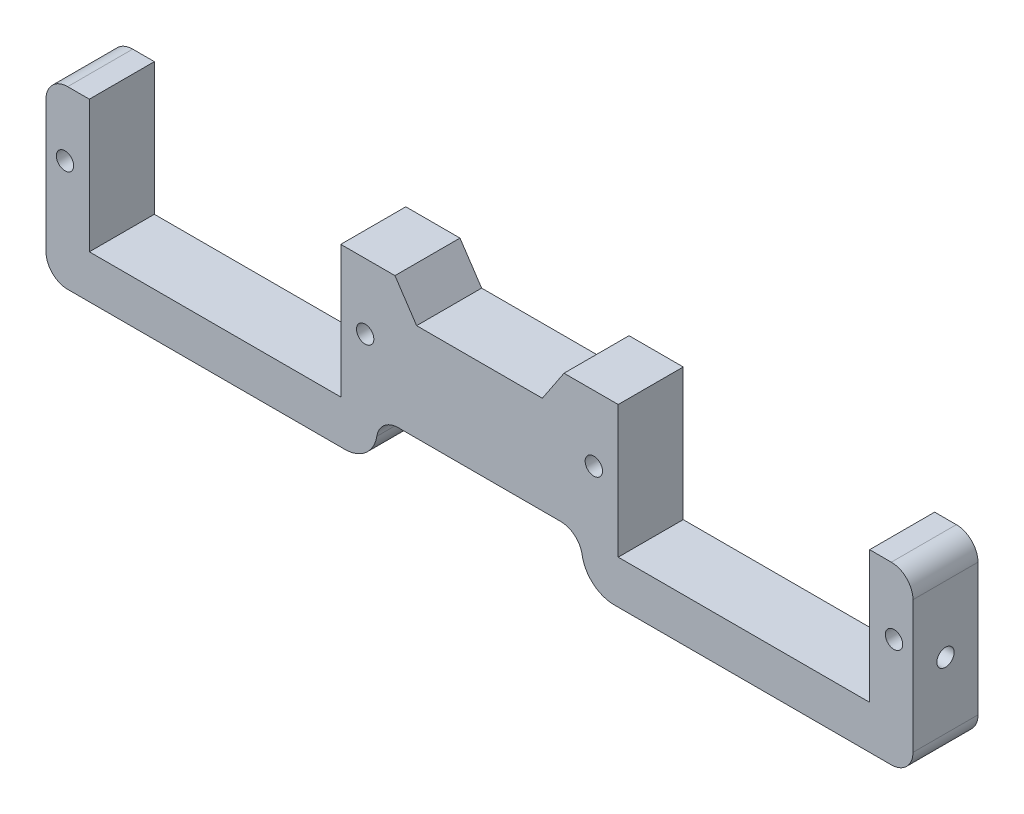
ISO-10303-21;
HEADER;
FILE_DESCRIPTION(('STEP AP214'),'2;1');
FILE_NAME('part.step','',(''),(''),'','','');
FILE_SCHEMA(('AUTOMOTIVE_DESIGN { 1 0 10303 214 1 1 1 1 }'));
ENDSEC;
DATA;
#1=APPLICATION_CONTEXT('core data for automotive mechanical design processes');
#2=APPLICATION_PROTOCOL_DEFINITION('international standard','automotive_design',2000,#1);
#3=PRODUCT_CONTEXT('',#1,'mechanical');
#4=PRODUCT('Part','Part','',(#3));
#5=PRODUCT_RELATED_PRODUCT_CATEGORY('part','',(#4));
#6=PRODUCT_DEFINITION_FORMATION('','',#4);
#7=PRODUCT_DEFINITION_CONTEXT('part definition',#1,'design');
#8=PRODUCT_DEFINITION('design','',#6,#7);
#9=PRODUCT_DEFINITION_SHAPE('','',#8);
#10=(LENGTH_UNIT() NAMED_UNIT(*) SI_UNIT(.MILLI.,.METRE.));
#11=(NAMED_UNIT(*) PLANE_ANGLE_UNIT() SI_UNIT($,.RADIAN.));
#12=(NAMED_UNIT(*) SI_UNIT($,.STERADIAN.) SOLID_ANGLE_UNIT());
#13=UNCERTAINTY_MEASURE_WITH_UNIT(LENGTH_MEASURE(1.E-05),#10,'distance_accuracy_value','');
#14=(GEOMETRIC_REPRESENTATION_CONTEXT(3) GLOBAL_UNCERTAINTY_ASSIGNED_CONTEXT((#13)) GLOBAL_UNIT_ASSIGNED_CONTEXT((#10,
#11,#12)) REPRESENTATION_CONTEXT('',''));
#15=CARTESIAN_POINT('',(0.,0.,0.));
#16=DIRECTION('',(0.,0.,1.));
#17=DIRECTION('',(1.,0.,0.));
#18=AXIS2_PLACEMENT_3D('',#15,#16,#17);
#19=CARTESIAN_POINT('',(38.,14.2,3.));
#20=DIRECTION('',(0.,0.,-1.));
#21=DIRECTION('',(-1.,0.,0.));
#22=AXIS2_PLACEMENT_3D('',#19,#20,#21);
#23=PLANE('',#22);
#24=CARTESIAN_POINT('',(7.49999999999999,2.19994295650091,3.));
#25=DIRECTION('',(0.,0.,-1.));
#26=DIRECTION('',(1.,0.,0.));
#27=AXIS2_PLACEMENT_3D('',#24,#25,#26);
#28=CIRCLE('',#27,2.);
#29=CARTESIAN_POINT('',(7.49999999999999,4.19994295650091,3.));
#30=VERTEX_POINT('',#29);
#31=CARTESIAN_POINT('',(9.47423033011439,2.51996577390055,3.));
#32=VERTEX_POINT('',#31);
#33=EDGE_CURVE('E489',#30,#32,#28,.T.);
#34=ORIENTED_EDGE('',*,*,#33,.T.);
#35=CARTESIAN_POINT('',(12.435575825286,3.,3.));
#36=DIRECTION('',(0.,0.,-1.));
#37=DIRECTION('',(-1.,0.,0.));
#38=AXIS2_PLACEMENT_3D('',#35,#36,#37);
#39=CIRCLE('',#38,3.);
#40=CARTESIAN_POINT('',(12.435575825286,0.,3.));
#41=VERTEX_POINT('',#40);
#42=EDGE_CURVE('E266',#32,#41,#39,.F.);
#43=ORIENTED_EDGE('',*,*,#42,.T.);
#44=DIRECTION('',(1.,0.,0.));
#45=VECTOR('',#44,1.);
#46=CARTESIAN_POINT('',(9.50000000000001,0.,3.));
#47=LINE('',#46,#45);
#48=CARTESIAN_POINT('',(38.,0.,3.));
#49=VERTEX_POINT('',#48);
#50=EDGE_CURVE('E486',#41,#49,#47,.T.);
#51=ORIENTED_EDGE('',*,*,#50,.T.);
#52=CARTESIAN_POINT('',(38.,2.,3.));
#53=DIRECTION('',(0.,0.,1.));
#54=DIRECTION('',(1.,0.,0.));
#55=AXIS2_PLACEMENT_3D('',#52,#53,#54);
#56=CIRCLE('',#55,2.);
#57=CARTESIAN_POINT('',(40.,2.,3.));
#58=VERTEX_POINT('',#57);
#59=EDGE_CURVE('E483',#49,#58,#56,.T.);
#60=ORIENTED_EDGE('',*,*,#59,.T.);
#61=DIRECTION('',(0.,1.,0.));
#62=VECTOR('',#61,1.);
#63=CARTESIAN_POINT('',(40.,2.00000000000001,3.));
#64=LINE('',#63,#62);
#65=CARTESIAN_POINT('',(40.,14.2,3.));
#66=VERTEX_POINT('',#65);
#67=EDGE_CURVE('E480',#58,#66,#64,.T.);
#68=ORIENTED_EDGE('',*,*,#67,.T.);
#69=CARTESIAN_POINT('',(38.,14.2,3.));
#70=DIRECTION('',(0.,0.,1.));
#71=DIRECTION('',(-1.,0.,0.));
#72=AXIS2_PLACEMENT_3D('',#69,#70,#71);
#73=CIRCLE('',#72,2.);
#74=CARTESIAN_POINT('',(38.,16.2,3.));
#75=VERTEX_POINT('',#74);
#76=EDGE_CURVE('E477',#66,#75,#73,.T.);
#77=ORIENTED_EDGE('',*,*,#76,.T.);
#78=DIRECTION('',(-1.,0.,0.));
#79=VECTOR('',#78,1.);
#80=CARTESIAN_POINT('',(38.,16.2,3.));
#81=LINE('',#80,#79);
#82=CARTESIAN_POINT('',(36.,16.2,3.));
#83=VERTEX_POINT('',#82);
#84=EDGE_CURVE('E474',#75,#83,#81,.T.);
#85=ORIENTED_EDGE('',*,*,#84,.T.);
#86=DIRECTION('',(0.,-1.,0.));
#87=VECTOR('',#86,1.);
#88=CARTESIAN_POINT('',(36.,16.2,3.));
#89=LINE('',#88,#87);
#90=CARTESIAN_POINT('',(36.,4.00000000000001,3.));
#91=VERTEX_POINT('',#90);
#92=EDGE_CURVE('E471',#83,#91,#89,.T.);
#93=ORIENTED_EDGE('',*,*,#92,.T.);
#94=DIRECTION('',(-1.,0.,0.));
#95=VECTOR('',#94,1.);
#96=CARTESIAN_POINT('',(36.,4.00000000000001,3.));
#97=LINE('',#96,#95);
#98=CARTESIAN_POINT('',(12.8,4.,3.));
#99=VERTEX_POINT('',#98);
#100=EDGE_CURVE('E468',#91,#99,#97,.T.);
#101=ORIENTED_EDGE('',*,*,#100,.T.);
#102=DIRECTION('',(0.,1.,0.));
#103=VECTOR('',#102,1.);
#104=CARTESIAN_POINT('',(12.8,4.,3.));
#105=LINE('',#104,#103);
#106=CARTESIAN_POINT('',(12.8,16.2,3.));
#107=VERTEX_POINT('',#106);
#108=EDGE_CURVE('E465',#99,#107,#105,.T.);
#109=ORIENTED_EDGE('',*,*,#108,.T.);
#110=DIRECTION('',(-1.,0.,0.));
#111=VECTOR('',#110,1.);
#112=CARTESIAN_POINT('',(12.8,16.2,3.));
#113=LINE('',#112,#111);
#114=CARTESIAN_POINT('',(7.8,16.2,3.));
#115=VERTEX_POINT('',#114);
#116=EDGE_CURVE('E462',#107,#115,#113,.T.);
#117=ORIENTED_EDGE('',*,*,#116,.T.);
#118=DIRECTION('',(-0.554692894290729,-0.832055162247897,0.));
#119=VECTOR('',#118,1.);
#120=CARTESIAN_POINT('',(7.8,16.2,3.));
#121=LINE('',#120,#119);
#122=CARTESIAN_POINT('',(5.8,13.1999429565009,3.));
#123=VERTEX_POINT('',#122);
#124=EDGE_CURVE('E459',#115,#123,#121,.T.);
#125=ORIENTED_EDGE('',*,*,#124,.T.);
#126=DIRECTION('',(-1.,0.,0.));
#127=VECTOR('',#126,1.);
#128=CARTESIAN_POINT('',(-5.8,13.1999429565009,3.));
#129=LINE('',#128,#127);
#130=CARTESIAN_POINT('',(-5.8,13.1999429565009,3.));
#131=VERTEX_POINT('',#130);
#132=EDGE_CURVE('E456',#123,#131,#129,.T.);
#133=ORIENTED_EDGE('',*,*,#132,.T.);
#134=DIRECTION('',(-0.554692894290729,0.832055162247897,0.));
#135=VECTOR('',#134,1.);
#136=CARTESIAN_POINT('',(-7.8,16.2,3.));
#137=LINE('',#136,#135);
#138=CARTESIAN_POINT('',(-7.8,16.2,3.));
#139=VERTEX_POINT('',#138);
#140=EDGE_CURVE('E453',#131,#139,#137,.T.);
#141=ORIENTED_EDGE('',*,*,#140,.T.);
#142=DIRECTION('',(-1.,0.,0.));
#143=VECTOR('',#142,1.);
#144=CARTESIAN_POINT('',(-12.8,16.2,3.));
#145=LINE('',#144,#143);
#146=CARTESIAN_POINT('',(-12.8,16.2,3.));
#147=VERTEX_POINT('',#146);
#148=EDGE_CURVE('E450',#139,#147,#145,.T.);
#149=ORIENTED_EDGE('',*,*,#148,.T.);
#150=DIRECTION('',(0.,-1.,0.));
#151=VECTOR('',#150,1.);
#152=CARTESIAN_POINT('',(-12.8,4.,3.));
#153=LINE('',#152,#151);
#154=CARTESIAN_POINT('',(-12.8,4.,3.));
#155=VERTEX_POINT('',#154);
#156=EDGE_CURVE('E447',#147,#155,#153,.T.);
#157=ORIENTED_EDGE('',*,*,#156,.T.);
#158=DIRECTION('',(-1.,0.,0.));
#159=VECTOR('',#158,1.);
#160=CARTESIAN_POINT('',(-36.,4.,3.));
#161=LINE('',#160,#159);
#162=CARTESIAN_POINT('',(-36.,4.,3.));
#163=VERTEX_POINT('',#162);
#164=EDGE_CURVE('E234',#155,#163,#161,.T.);
#165=ORIENTED_EDGE('',*,*,#164,.T.);
#166=DIRECTION('',(0.,1.,0.));
#167=VECTOR('',#166,1.);
#168=CARTESIAN_POINT('',(-36.,16.2,3.));
#169=LINE('',#168,#167);
#170=CARTESIAN_POINT('',(-36.,16.2,3.));
#171=VERTEX_POINT('',#170);
#172=EDGE_CURVE('E228',#163,#171,#169,.T.);
#173=ORIENTED_EDGE('',*,*,#172,.T.);
#174=DIRECTION('',(-1.,0.,0.));
#175=VECTOR('',#174,1.);
#176=CARTESIAN_POINT('',(-38.,16.2,3.));
#177=LINE('',#176,#175);
#178=CARTESIAN_POINT('',(-38.,16.2,3.));
#179=VERTEX_POINT('',#178);
#180=EDGE_CURVE('E217',#171,#179,#177,.T.);
#181=ORIENTED_EDGE('',*,*,#180,.T.);
#182=CARTESIAN_POINT('',(-38.,14.2,3.));
#183=DIRECTION('',(0.,0.,1.));
#184=DIRECTION('',(-1.,0.,0.));
#185=AXIS2_PLACEMENT_3D('',#182,#183,#184);
#186=CIRCLE('',#185,2.);
#187=CARTESIAN_POINT('',(-40.,14.2,3.));
#188=VERTEX_POINT('',#187);
#189=EDGE_CURVE('E227',#179,#188,#186,.T.);
#190=ORIENTED_EDGE('',*,*,#189,.T.);
#191=DIRECTION('',(0.,-1.,0.));
#192=VECTOR('',#191,1.);
#193=CARTESIAN_POINT('',(-40.,2.00000000000001,3.));
#194=LINE('',#193,#192);
#195=CARTESIAN_POINT('',(-40.,2.00000000000001,3.));
#196=VERTEX_POINT('',#195);
#197=EDGE_CURVE('E428',#188,#196,#194,.T.);
#198=ORIENTED_EDGE('',*,*,#197,.T.);
#199=CARTESIAN_POINT('',(-38.,2.,3.));
#200=DIRECTION('',(0.,0.,1.));
#201=DIRECTION('',(1.,0.,0.));
#202=AXIS2_PLACEMENT_3D('',#199,#200,#201);
#203=CIRCLE('',#202,2.);
#204=CARTESIAN_POINT('',(-38.,0.,3.));
#205=VERTEX_POINT('',#204);
#206=EDGE_CURVE('E500',#196,#205,#203,.T.);
#207=ORIENTED_EDGE('',*,*,#206,.T.);
#208=DIRECTION('',(1.,0.,0.));
#209=VECTOR('',#208,1.);
#210=CARTESIAN_POINT('',(-9.5,0.,3.));
#211=LINE('',#210,#209);
#212=CARTESIAN_POINT('',(-12.435575825286,0.,3.));
#213=VERTEX_POINT('',#212);
#214=EDGE_CURVE('E497',#205,#213,#211,.T.);
#215=ORIENTED_EDGE('',*,*,#214,.T.);
#216=CARTESIAN_POINT('',(-12.435575825286,3.,3.));
#217=DIRECTION('',(0.,0.,-1.));
#218=DIRECTION('',(-1.,0.,0.));
#219=AXIS2_PLACEMENT_3D('',#216,#217,#218);
#220=CIRCLE('',#219,3.);
#221=CARTESIAN_POINT('',(-9.47423033011439,2.51996577390055,3.));
#222=VERTEX_POINT('',#221);
#223=EDGE_CURVE('E59',#213,#222,#220,.F.);
#224=ORIENTED_EDGE('',*,*,#223,.T.);
#225=CARTESIAN_POINT('',(-7.49999999999999,2.19994295650091,3.));
#226=DIRECTION('',(0.,0.,-1.));
#227=DIRECTION('',(1.,0.,0.));
#228=AXIS2_PLACEMENT_3D('',#225,#226,#227);
#229=CIRCLE('',#228,2.);
#230=CARTESIAN_POINT('',(-7.49999999999999,4.19994295650091,3.));
#231=VERTEX_POINT('',#230);
#232=EDGE_CURVE('E277',#222,#231,#229,.T.);
#233=ORIENTED_EDGE('',*,*,#232,.T.);
#234=DIRECTION('',(1.,0.,0.));
#235=VECTOR('',#234,1.);
#236=CARTESIAN_POINT('',(7.49999999999999,4.19994295650091,3.));
#237=LINE('',#236,#235);
#238=EDGE_CURVE('E492',#231,#30,#237,.T.);
#239=ORIENTED_EDGE('',*,*,#238,.T.);
#240=EDGE_LOOP('',(#34,#43,#51,#60,#68,#77,#85,#93,#101,#109,#117,#125,#133,#141,#149,#157,#165,
#173,#181,#190,#198,#207,#215,#224,#233,#239));
#241=FACE_BOUND('',#240,.T.);
#242=CARTESIAN_POINT('',(-10.55,10.1499443478185,3.));
#243=DIRECTION('',(0.,0.,1.));
#244=DIRECTION('',(1.,0.,0.));
#245=AXIS2_PLACEMENT_3D('',#242,#243,#244);
#246=CIRCLE('',#245,0.800000000000001);
#247=CARTESIAN_POINT('',(-9.75,10.1499443478185,3.));
#248=VERTEX_POINT('',#247);
#249=EDGE_CURVE('E444',#248,#248,#246,.T.);
#250=ORIENTED_EDGE('',*,*,#249,.F.);
#251=EDGE_LOOP('',(#250));
#252=FACE_BOUND('',#251,.T.);
#253=CARTESIAN_POINT('',(-38.25,10.1499443478185,3.));
#254=DIRECTION('',(0.,0.,1.));
#255=DIRECTION('',(1.,0.,0.));
#256=AXIS2_PLACEMENT_3D('',#253,#254,#255);
#257=CIRCLE('',#256,0.800000000000002);
#258=CARTESIAN_POINT('',(-37.45,10.1499443478185,3.));
#259=VERTEX_POINT('',#258);
#260=EDGE_CURVE('E511',#259,#259,#257,.T.);
#261=ORIENTED_EDGE('',*,*,#260,.F.);
#262=EDGE_LOOP('',(#261));
#263=FACE_BOUND('',#262,.T.);
#264=CARTESIAN_POINT('',(38.25,10.1499443478185,3.));
#265=DIRECTION('',(0.,0.,1.));
#266=DIRECTION('',(-1.,0.,0.));
#267=AXIS2_PLACEMENT_3D('',#264,#265,#266);
#268=CIRCLE('',#267,0.800000000000002);
#269=CARTESIAN_POINT('',(37.45,10.1499443478185,3.));
#270=VERTEX_POINT('',#269);
#271=EDGE_CURVE('E519',#270,#270,#268,.T.);
#272=ORIENTED_EDGE('',*,*,#271,.F.);
#273=EDGE_LOOP('',(#272));
#274=FACE_BOUND('',#273,.T.);
#275=CARTESIAN_POINT('',(10.55,10.1499443478185,3.));
#276=DIRECTION('',(0.,0.,1.));
#277=DIRECTION('',(-1.,0.,0.));
#278=AXIS2_PLACEMENT_3D('',#275,#276,#277);
#279=CIRCLE('',#278,0.800000000000001);
#280=CARTESIAN_POINT('',(9.75,10.1499443478185,3.));
#281=VERTEX_POINT('',#280);
#282=EDGE_CURVE('E527',#281,#281,#279,.T.);
#283=ORIENTED_EDGE('',*,*,#282,.F.);
#284=EDGE_LOOP('',(#283));
#285=FACE_BOUND('',#284,.T.);
#286=ADVANCED_FACE('F43',(#241,#252,#263,#274,#285),#23,.F.);
#287=CARTESIAN_POINT('',(38.,14.2,-3.));
#288=DIRECTION('',(0.,0.,-1.));
#289=DIRECTION('',(-1.,0.,0.));
#290=AXIS2_PLACEMENT_3D('',#287,#288,#289);
#291=PLANE('',#290);
#292=CARTESIAN_POINT('',(38.25,10.1499443478185,-3.));
#293=DIRECTION('',(0.,0.,1.));
#294=DIRECTION('',(-1.,0.,0.));
#295=AXIS2_PLACEMENT_3D('',#292,#293,#294);
#296=CIRCLE('',#295,0.800000000000002);
#297=CARTESIAN_POINT('',(37.45,10.1499443478185,-3.));
#298=VERTEX_POINT('',#297);
#299=EDGE_CURVE('E523',#298,#298,#296,.T.);
#300=ORIENTED_EDGE('',*,*,#299,.T.);
#301=EDGE_LOOP('',(#300));
#302=FACE_BOUND('',#301,.T.);
#303=CARTESIAN_POINT('',(-10.55,10.1499443478185,-3.));
#304=DIRECTION('',(0.,0.,1.));
#305=DIRECTION('',(1.,0.,0.));
#306=AXIS2_PLACEMENT_3D('',#303,#304,#305);
#307=CIRCLE('',#306,0.800000000000001);
#308=CARTESIAN_POINT('',(-9.75,10.1499443478185,-3.));
#309=VERTEX_POINT('',#308);
#310=EDGE_CURVE('E507',#309,#309,#307,.T.);
#311=ORIENTED_EDGE('',*,*,#310,.T.);
#312=EDGE_LOOP('',(#311));
#313=FACE_BOUND('',#312,.T.);
#314=DIRECTION('',(1.,0.,0.));
#315=VECTOR('',#314,1.);
#316=CARTESIAN_POINT('',(9.50000000000001,0.,-3.));
#317=LINE('',#316,#315);
#318=CARTESIAN_POINT('',(12.435575825286,0.,-3.));
#319=VERTEX_POINT('',#318);
#320=CARTESIAN_POINT('',(38.,0.,-3.));
#321=VERTEX_POINT('',#320);
#322=EDGE_CURVE('E301',#319,#321,#317,.T.);
#323=ORIENTED_EDGE('',*,*,#322,.F.);
#324=CARTESIAN_POINT('',(12.435575825286,3.,-3.));
#325=DIRECTION('',(0.,0.,-1.));
#326=DIRECTION('',(-1.,0.,0.));
#327=AXIS2_PLACEMENT_3D('',#324,#325,#326);
#328=CIRCLE('',#327,3.);
#329=CARTESIAN_POINT('',(9.47423033011439,2.51996577390055,-3.));
#330=VERTEX_POINT('',#329);
#331=EDGE_CURVE('E258',#319,#330,#328,.T.);
#332=ORIENTED_EDGE('',*,*,#331,.T.);
#333=CARTESIAN_POINT('',(7.49999999999999,2.19994295650091,-3.));
#334=DIRECTION('',(0.,0.,-1.));
#335=DIRECTION('',(1.,0.,0.));
#336=AXIS2_PLACEMENT_3D('',#333,#334,#335);
#337=CIRCLE('',#336,2.);
#338=CARTESIAN_POINT('',(7.49999999999999,4.19994295650091,-3.));
#339=VERTEX_POINT('',#338);
#340=EDGE_CURVE('E292',#339,#330,#337,.T.);
#341=ORIENTED_EDGE('',*,*,#340,.F.);
#342=DIRECTION('',(1.,0.,0.));
#343=VECTOR('',#342,1.);
#344=CARTESIAN_POINT('',(7.49999999999999,4.19994295650091,-3.));
#345=LINE('',#344,#343);
#346=CARTESIAN_POINT('',(-7.49999999999999,4.19994295650091,-3.));
#347=VERTEX_POINT('',#346);
#348=EDGE_CURVE('E286',#347,#339,#345,.T.);
#349=ORIENTED_EDGE('',*,*,#348,.F.);
#350=CARTESIAN_POINT('',(-7.49999999999999,2.19994295650091,-3.));
#351=DIRECTION('',(0.,0.,-1.));
#352=DIRECTION('',(1.,0.,0.));
#353=AXIS2_PLACEMENT_3D('',#350,#351,#352);
#354=CIRCLE('',#353,2.);
#355=CARTESIAN_POINT('',(-9.47423033011439,2.51996577390055,-3.));
#356=VERTEX_POINT('',#355);
#357=EDGE_CURVE('E275',#356,#347,#354,.T.);
#358=ORIENTED_EDGE('',*,*,#357,.F.);
#359=CARTESIAN_POINT('',(-12.435575825286,3.,-3.));
#360=DIRECTION('',(0.,0.,-1.));
#361=DIRECTION('',(-1.,0.,0.));
#362=AXIS2_PLACEMENT_3D('',#359,#360,#361);
#363=CIRCLE('',#362,3.);
#364=CARTESIAN_POINT('',(-12.435575825286,0.,-3.));
#365=VERTEX_POINT('',#364);
#366=EDGE_CURVE('E250',#356,#365,#363,.T.);
#367=ORIENTED_EDGE('',*,*,#366,.T.);
#368=DIRECTION('',(1.,0.,0.));
#369=VECTOR('',#368,1.);
#370=CARTESIAN_POINT('',(-9.5,0.,-3.));
#371=LINE('',#370,#369);
#372=CARTESIAN_POINT('',(-38.,0.,-3.));
#373=VERTEX_POINT('',#372);
#374=EDGE_CURVE('E288',#373,#365,#371,.T.);
#375=ORIENTED_EDGE('',*,*,#374,.F.);
#376=CARTESIAN_POINT('',(-38.,2.,-3.));
#377=DIRECTION('',(0.,0.,1.));
#378=DIRECTION('',(1.,0.,0.));
#379=AXIS2_PLACEMENT_3D('',#376,#377,#378);
#380=CIRCLE('',#379,2.);
#381=CARTESIAN_POINT('',(-40.,2.00000000000001,-3.));
#382=VERTEX_POINT('',#381);
#383=EDGE_CURVE('E294',#382,#373,#380,.T.);
#384=ORIENTED_EDGE('',*,*,#383,.F.);
#385=DIRECTION('',(0.,-1.,0.));
#386=VECTOR('',#385,1.);
#387=CARTESIAN_POINT('',(-40.,2.00000000000001,-3.));
#388=LINE('',#387,#386);
#389=CARTESIAN_POINT('',(-40.,14.2,-3.));
#390=VERTEX_POINT('',#389);
#391=EDGE_CURVE('E427',#390,#382,#388,.T.);
#392=ORIENTED_EDGE('',*,*,#391,.F.);
#393=CARTESIAN_POINT('',(-38.,14.2,-3.));
#394=DIRECTION('',(0.,0.,1.));
#395=DIRECTION('',(-1.,0.,0.));
#396=AXIS2_PLACEMENT_3D('',#393,#394,#395);
#397=CIRCLE('',#396,2.);
#398=CARTESIAN_POINT('',(-38.,16.2,-3.));
#399=VERTEX_POINT('',#398);
#400=EDGE_CURVE('E432',#399,#390,#397,.T.);
#401=ORIENTED_EDGE('',*,*,#400,.F.);
#402=DIRECTION('',(-1.,0.,0.));
#403=VECTOR('',#402,1.);
#404=CARTESIAN_POINT('',(-38.,16.2,-3.));
#405=LINE('',#404,#403);
#406=CARTESIAN_POINT('',(-36.,16.2,-3.));
#407=VERTEX_POINT('',#406);
#408=EDGE_CURVE('E437',#407,#399,#405,.T.);
#409=ORIENTED_EDGE('',*,*,#408,.F.);
#410=DIRECTION('',(0.,1.,0.));
#411=VECTOR('',#410,1.);
#412=CARTESIAN_POINT('',(-36.,16.2,-3.));
#413=LINE('',#412,#411);
#414=CARTESIAN_POINT('',(-36.,4.,-3.));
#415=VERTEX_POINT('',#414);
#416=EDGE_CURVE('E243',#415,#407,#413,.T.);
#417=ORIENTED_EDGE('',*,*,#416,.F.);
#418=DIRECTION('',(-1.,0.,0.));
#419=VECTOR('',#418,1.);
#420=CARTESIAN_POINT('',(-36.,4.,-3.));
#421=LINE('',#420,#419);
#422=CARTESIAN_POINT('',(-12.8,4.,-3.));
#423=VERTEX_POINT('',#422);
#424=EDGE_CURVE('E239',#423,#415,#421,.T.);
#425=ORIENTED_EDGE('',*,*,#424,.F.);
#426=DIRECTION('',(0.,-1.,0.));
#427=VECTOR('',#426,1.);
#428=CARTESIAN_POINT('',(-12.8,4.,-3.));
#429=LINE('',#428,#427);
#430=CARTESIAN_POINT('',(-12.8,16.2,-3.));
#431=VERTEX_POINT('',#430);
#432=EDGE_CURVE('E341',#431,#423,#429,.T.);
#433=ORIENTED_EDGE('',*,*,#432,.F.);
#434=DIRECTION('',(-1.,0.,0.));
#435=VECTOR('',#434,1.);
#436=CARTESIAN_POINT('',(-12.8,16.2,-3.));
#437=LINE('',#436,#435);
#438=CARTESIAN_POINT('',(-7.8,16.2,-3.));
#439=VERTEX_POINT('',#438);
#440=EDGE_CURVE('E338',#439,#431,#437,.T.);
#441=ORIENTED_EDGE('',*,*,#440,.F.);
#442=DIRECTION('',(-0.554692894290729,0.832055162247897,0.));
#443=VECTOR('',#442,1.);
#444=CARTESIAN_POINT('',(-7.8,16.2,-3.));
#445=LINE('',#444,#443);
#446=CARTESIAN_POINT('',(-5.8,13.1999429565009,-3.));
#447=VERTEX_POINT('',#446);
#448=EDGE_CURVE('E335',#447,#439,#445,.T.);
#449=ORIENTED_EDGE('',*,*,#448,.F.);
#450=DIRECTION('',(-1.,0.,0.));
#451=VECTOR('',#450,1.);
#452=CARTESIAN_POINT('',(-5.8,13.1999429565009,-3.));
#453=LINE('',#452,#451);
#454=CARTESIAN_POINT('',(5.8,13.1999429565009,-3.));
#455=VERTEX_POINT('',#454);
#456=EDGE_CURVE('E332',#455,#447,#453,.T.);
#457=ORIENTED_EDGE('',*,*,#456,.F.);
#458=DIRECTION('',(-0.554692894290729,-0.832055162247897,0.));
#459=VECTOR('',#458,1.);
#460=CARTESIAN_POINT('',(7.8,16.2,-3.));
#461=LINE('',#460,#459);
#462=CARTESIAN_POINT('',(7.8,16.2,-3.));
#463=VERTEX_POINT('',#462);
#464=EDGE_CURVE('E329',#463,#455,#461,.T.);
#465=ORIENTED_EDGE('',*,*,#464,.F.);
#466=DIRECTION('',(-1.,0.,0.));
#467=VECTOR('',#466,1.);
#468=CARTESIAN_POINT('',(11.,16.2,-3.));
#469=LINE('',#468,#467);
#470=CARTESIAN_POINT('',(12.8,16.2,-3.));
#471=VERTEX_POINT('',#470);
#472=EDGE_CURVE('E326',#471,#463,#469,.T.);
#473=ORIENTED_EDGE('',*,*,#472,.F.);
#474=DIRECTION('',(0.,1.,0.));
#475=VECTOR('',#474,1.);
#476=CARTESIAN_POINT('',(12.8,4.,-3.));
#477=LINE('',#476,#475);
#478=CARTESIAN_POINT('',(12.8,4.,-3.));
#479=VERTEX_POINT('',#478);
#480=EDGE_CURVE('E322',#479,#471,#477,.T.);
#481=ORIENTED_EDGE('',*,*,#480,.F.);
#482=DIRECTION('',(-1.,0.,0.));
#483=VECTOR('',#482,1.);
#484=CARTESIAN_POINT('',(36.,4.00000000000001,-3.));
#485=LINE('',#484,#483);
#486=CARTESIAN_POINT('',(36.,4.00000000000001,-3.));
#487=VERTEX_POINT('',#486);
#488=EDGE_CURVE('E319',#487,#479,#485,.T.);
#489=ORIENTED_EDGE('',*,*,#488,.F.);
#490=DIRECTION('',(0.,-1.,0.));
#491=VECTOR('',#490,1.);
#492=CARTESIAN_POINT('',(36.,16.2,-3.));
#493=LINE('',#492,#491);
#494=CARTESIAN_POINT('',(36.,16.2,-3.));
#495=VERTEX_POINT('',#494);
#496=EDGE_CURVE('E316',#495,#487,#493,.T.);
#497=ORIENTED_EDGE('',*,*,#496,.F.);
#498=DIRECTION('',(-1.,0.,0.));
#499=VECTOR('',#498,1.);
#500=CARTESIAN_POINT('',(38.,16.2,-3.));
#501=LINE('',#500,#499);
#502=CARTESIAN_POINT('',(38.,16.2,-3.));
#503=VERTEX_POINT('',#502);
#504=EDGE_CURVE('E313',#503,#495,#501,.T.);
#505=ORIENTED_EDGE('',*,*,#504,.F.);
#506=CARTESIAN_POINT('',(38.,14.2,-3.));
#507=DIRECTION('',(0.,0.,1.));
#508=DIRECTION('',(-1.,0.,0.));
#509=AXIS2_PLACEMENT_3D('',#506,#507,#508);
#510=CIRCLE('',#509,2.);
#511=CARTESIAN_POINT('',(40.,14.2,-3.));
#512=VERTEX_POINT('',#511);
#513=EDGE_CURVE('E310',#512,#503,#510,.T.);
#514=ORIENTED_EDGE('',*,*,#513,.F.);
#515=DIRECTION('',(0.,1.,0.));
#516=VECTOR('',#515,1.);
#517=CARTESIAN_POINT('',(40.,2.00000000000001,-3.));
#518=LINE('',#517,#516);
#519=CARTESIAN_POINT('',(40.,2.,-3.));
#520=VERTEX_POINT('',#519);
#521=EDGE_CURVE('E307',#520,#512,#518,.T.);
#522=ORIENTED_EDGE('',*,*,#521,.F.);
#523=CARTESIAN_POINT('',(38.,2.,-3.));
#524=DIRECTION('',(0.,0.,1.));
#525=DIRECTION('',(1.,0.,0.));
#526=AXIS2_PLACEMENT_3D('',#523,#524,#525);
#527=CIRCLE('',#526,2.);
#528=EDGE_CURVE('E304',#321,#520,#527,.T.);
#529=ORIENTED_EDGE('',*,*,#528,.F.);
#530=EDGE_LOOP('',(#323,#332,#341,#349,#358,#367,#375,#384,#392,#401,#409,#417,#425,#433,#441,
#449,#457,#465,#473,#481,#489,#497,#505,#514,#522,#529));
#531=FACE_BOUND('',#530,.T.);
#532=CARTESIAN_POINT('',(-38.25,10.1499443478185,-3.));
#533=DIRECTION('',(0.,0.,1.));
#534=DIRECTION('',(1.,0.,0.));
#535=AXIS2_PLACEMENT_3D('',#532,#533,#534);
#536=CIRCLE('',#535,0.800000000000002);
#537=CARTESIAN_POINT('',(-37.45,10.1499443478185,-3.));
#538=VERTEX_POINT('',#537);
#539=EDGE_CURVE('E515',#538,#538,#536,.T.);
#540=ORIENTED_EDGE('',*,*,#539,.T.);
#541=EDGE_LOOP('',(#540));
#542=FACE_BOUND('',#541,.T.);
#543=CARTESIAN_POINT('',(10.55,10.1499443478185,-3.));
#544=DIRECTION('',(0.,0.,1.));
#545=DIRECTION('',(-1.,0.,0.));
#546=AXIS2_PLACEMENT_3D('',#543,#544,#545);
#547=CIRCLE('',#546,0.800000000000001);
#548=CARTESIAN_POINT('',(9.75,10.1499443478185,-3.));
#549=VERTEX_POINT('',#548);
#550=EDGE_CURVE('E531',#549,#549,#547,.T.);
#551=ORIENTED_EDGE('',*,*,#550,.T.);
#552=EDGE_LOOP('',(#551));
#553=FACE_BOUND('',#552,.T.);
#554=ADVANCED_FACE('F282',(#302,#313,#531,#542,#553),#291,.T.);
#555=CARTESIAN_POINT('',(-36.,16.2,3.));
#556=DIRECTION('',(-1.,0.,0.));
#557=DIRECTION('',(0.,0.,1.));
#558=AXIS2_PLACEMENT_3D('',#555,#556,#557);
#559=PLANE('',#558);
#560=ORIENTED_EDGE('',*,*,#416,.T.);
#561=DIRECTION('',(0.,0.,-1.));
#562=VECTOR('',#561,1.);
#563=CARTESIAN_POINT('',(-36.,16.2,3.));
#564=LINE('',#563,#562);
#565=EDGE_CURVE('E221',#171,#407,#564,.T.);
#566=ORIENTED_EDGE('',*,*,#565,.F.);
#567=ORIENTED_EDGE('',*,*,#172,.F.);
#568=DIRECTION('',(0.,0.,-1.));
#569=VECTOR('',#568,1.);
#570=CARTESIAN_POINT('',(-36.,4.,3.));
#571=LINE('',#570,#569);
#572=EDGE_CURVE('E346',#163,#415,#571,.T.);
#573=ORIENTED_EDGE('',*,*,#572,.T.);
#574=EDGE_LOOP('',(#560,#566,#567,#573));
#575=FACE_BOUND('',#574,.T.);
#576=ADVANCED_FACE('F241',(#575),#559,.F.);
#577=CARTESIAN_POINT('',(-38.,16.2,3.));
#578=DIRECTION('',(0.,-1.,0.));
#579=DIRECTION('',(1.,0.,0.));
#580=AXIS2_PLACEMENT_3D('',#577,#578,#579);
#581=PLANE('',#580);
#582=ORIENTED_EDGE('',*,*,#408,.T.);
#583=DIRECTION('',(0.,0.,-1.));
#584=VECTOR('',#583,1.);
#585=CARTESIAN_POINT('',(-38.,16.2,3.));
#586=LINE('',#585,#584);
#587=EDGE_CURVE('E224',#179,#399,#586,.T.);
#588=ORIENTED_EDGE('',*,*,#587,.F.);
#589=ORIENTED_EDGE('',*,*,#180,.F.);
#590=ORIENTED_EDGE('',*,*,#565,.T.);
#591=EDGE_LOOP('',(#582,#588,#589,#590));
#592=FACE_BOUND('',#591,.T.);
#593=ADVANCED_FACE('F219',(#592),#581,.F.);
#594=CARTESIAN_POINT('',(-38.,14.2,3.));
#595=DIRECTION('',(0.,0.,-1.));
#596=DIRECTION('',(-1.,0.,0.));
#597=AXIS2_PLACEMENT_3D('',#594,#595,#596);
#598=CYLINDRICAL_SURFACE('',#597,2.);
#599=ORIENTED_EDGE('',*,*,#400,.T.);
#600=DIRECTION('',(0.,0.,-1.));
#601=VECTOR('',#600,1.);
#602=CARTESIAN_POINT('',(-40.,14.2,3.));
#603=LINE('',#602,#601);
#604=EDGE_CURVE('E252',#188,#390,#603,.T.);
#605=ORIENTED_EDGE('',*,*,#604,.F.);
#606=ORIENTED_EDGE('',*,*,#189,.F.);
#607=ORIENTED_EDGE('',*,*,#587,.T.);
#608=EDGE_LOOP('',(#599,#605,#606,#607));
#609=FACE_BOUND('',#608,.T.);
#610=ADVANCED_FACE('F915',(#609),#598,.T.);
#611=CARTESIAN_POINT('',(-40.,2.00000000000001,3.));
#612=DIRECTION('',(1.,0.,0.));
#613=DIRECTION('',(0.,1.,0.));
#614=AXIS2_PLACEMENT_3D('',#611,#612,#613);
#615=PLANE('',#614);
#616=ORIENTED_EDGE('',*,*,#391,.T.);
#617=DIRECTION('',(0.,0.,-1.));
#618=VECTOR('',#617,1.);
#619=CARTESIAN_POINT('',(-40.,2.00000000000001,3.));
#620=LINE('',#619,#618);
#621=EDGE_CURVE('E416',#196,#382,#620,.T.);
#622=ORIENTED_EDGE('',*,*,#621,.F.);
#623=ORIENTED_EDGE('',*,*,#197,.F.);
#624=ORIENTED_EDGE('',*,*,#604,.T.);
#625=EDGE_LOOP('',(#616,#622,#623,#624));
#626=FACE_BOUND('',#625,.T.);
#627=ADVANCED_FACE('F425',(#626),#615,.F.);
#628=CARTESIAN_POINT('',(-38.,2.,3.));
#629=DIRECTION('',(0.,0.,-1.));
#630=DIRECTION('',(-1.,0.,0.));
#631=AXIS2_PLACEMENT_3D('',#628,#629,#630);
#632=CYLINDRICAL_SURFACE('',#631,2.);
#633=ORIENTED_EDGE('',*,*,#383,.T.);
#634=DIRECTION('',(0.,0.,-1.));
#635=VECTOR('',#634,1.);
#636=CARTESIAN_POINT('',(-38.,0.,3.));
#637=LINE('',#636,#635);
#638=EDGE_CURVE('E412',#205,#373,#637,.T.);
#639=ORIENTED_EDGE('',*,*,#638,.F.);
#640=ORIENTED_EDGE('',*,*,#206,.F.);
#641=ORIENTED_EDGE('',*,*,#621,.T.);
#642=EDGE_LOOP('',(#633,#639,#640,#641));
#643=FACE_BOUND('',#642,.T.);
#644=ADVANCED_FACE('F895',(#643),#632,.T.);
#645=CARTESIAN_POINT('',(-9.5,0.,3.));
#646=DIRECTION('',(0.,1.,0.));
#647=DIRECTION('',(0.,0.,1.));
#648=AXIS2_PLACEMENT_3D('',#645,#646,#647);
#649=PLANE('',#648);
#650=ORIENTED_EDGE('',*,*,#374,.T.);
#651=DIRECTION('',(0.,0.,-1.));
#652=VECTOR('',#651,1.);
#653=CARTESIAN_POINT('',(-12.435575825286,0.,3.));
#654=LINE('',#653,#652);
#655=EDGE_CURVE('E11',#365,#213,#654,.F.);
#656=ORIENTED_EDGE('',*,*,#655,.T.);
#657=ORIENTED_EDGE('',*,*,#214,.F.);
#658=ORIENTED_EDGE('',*,*,#638,.T.);
#659=EDGE_LOOP('',(#650,#656,#657,#658));
#660=FACE_BOUND('',#659,.T.);
#661=ADVANCED_FACE('F616',(#660),#649,.F.);
#662=CARTESIAN_POINT('',(-7.49999999999999,2.19994295650091,3.));
#663=DIRECTION('',(0.,0.,-1.));
#664=DIRECTION('',(-1.,0.,0.));
#665=AXIS2_PLACEMENT_3D('',#662,#663,#664);
#666=CYLINDRICAL_SURFACE('',#665,2.);
#667=ORIENTED_EDGE('',*,*,#232,.F.);
#668=DIRECTION('',(0.,0.,-1.));
#669=VECTOR('',#668,1.);
#670=CARTESIAN_POINT('',(-9.47423033011439,2.51996577390055,3.));
#671=LINE('',#670,#669);
#672=EDGE_CURVE('E52',#222,#356,#671,.T.);
#673=ORIENTED_EDGE('',*,*,#672,.T.);
#674=ORIENTED_EDGE('',*,*,#357,.T.);
#675=DIRECTION('',(0.,0.,-1.));
#676=VECTOR('',#675,1.);
#677=CARTESIAN_POINT('',(-7.49999999999999,4.19994295650091,3.));
#678=LINE('',#677,#676);
#679=EDGE_CURVE('E409',#231,#347,#678,.T.);
#680=ORIENTED_EDGE('',*,*,#679,.F.);
#681=EDGE_LOOP('',(#667,#673,#674,#680));
#682=FACE_BOUND('',#681,.T.);
#683=ADVANCED_FACE('F273',(#682),#666,.F.);
#684=CARTESIAN_POINT('',(7.49999999999999,4.19994295650091,3.));
#685=DIRECTION('',(0.,1.,0.));
#686=DIRECTION('',(-1.,0.,0.));
#687=AXIS2_PLACEMENT_3D('',#684,#685,#686);
#688=PLANE('',#687);
#689=ORIENTED_EDGE('',*,*,#348,.T.);
#690=DIRECTION('',(0.,0.,-1.));
#691=VECTOR('',#690,1.);
#692=CARTESIAN_POINT('',(7.49999999999999,4.19994295650091,3.));
#693=LINE('',#692,#691);
#694=EDGE_CURVE('E405',#30,#339,#693,.T.);
#695=ORIENTED_EDGE('',*,*,#694,.F.);
#696=ORIENTED_EDGE('',*,*,#238,.F.);
#697=ORIENTED_EDGE('',*,*,#679,.T.);
#698=EDGE_LOOP('',(#689,#695,#696,#697));
#699=FACE_BOUND('',#698,.T.);
#700=ADVANCED_FACE('F608',(#699),#688,.F.);
#701=CARTESIAN_POINT('',(7.49999999999999,2.19994295650091,3.));
#702=DIRECTION('',(0.,0.,-1.));
#703=DIRECTION('',(-1.,0.,0.));
#704=AXIS2_PLACEMENT_3D('',#701,#702,#703);
#705=CYLINDRICAL_SURFACE('',#704,2.);
#706=ORIENTED_EDGE('',*,*,#340,.T.);
#707=DIRECTION('',(0.,0.,-1.));
#708=VECTOR('',#707,1.);
#709=CARTESIAN_POINT('',(9.47423033011439,2.51996577390055,3.));
#710=LINE('',#709,#708);
#711=EDGE_CURVE('E261',#330,#32,#710,.F.);
#712=ORIENTED_EDGE('',*,*,#711,.T.);
#713=ORIENTED_EDGE('',*,*,#33,.F.);
#714=ORIENTED_EDGE('',*,*,#694,.T.);
#715=EDGE_LOOP('',(#706,#712,#713,#714));
#716=FACE_BOUND('',#715,.T.);
#717=ADVANCED_FACE('F604',(#716),#705,.F.);
#718=CARTESIAN_POINT('',(9.50000000000001,0.,3.));
#719=DIRECTION('',(0.,1.,0.));
#720=DIRECTION('',(-1.,0.,0.));
#721=AXIS2_PLACEMENT_3D('',#718,#719,#720);
#722=PLANE('',#721);
#723=ORIENTED_EDGE('',*,*,#50,.F.);
#724=DIRECTION('',(0.,0.,-1.));
#725=VECTOR('',#724,1.);
#726=CARTESIAN_POINT('',(12.435575825286,0.,3.));
#727=LINE('',#726,#725);
#728=EDGE_CURVE('E245',#41,#319,#727,.T.);
#729=ORIENTED_EDGE('',*,*,#728,.T.);
#730=ORIENTED_EDGE('',*,*,#322,.T.);
#731=DIRECTION('',(0.,0.,-1.));
#732=VECTOR('',#731,1.);
#733=CARTESIAN_POINT('',(38.,0.,3.));
#734=LINE('',#733,#732);
#735=EDGE_CURVE('E401',#49,#321,#734,.T.);
#736=ORIENTED_EDGE('',*,*,#735,.F.);
#737=EDGE_LOOP('',(#723,#729,#730,#736));
#738=FACE_BOUND('',#737,.T.);
#739=ADVANCED_FACE('F596',(#738),#722,.F.);
#740=CARTESIAN_POINT('',(38.,2.,3.));
#741=DIRECTION('',(0.,0.,-1.));
#742=DIRECTION('',(-1.,0.,0.));
#743=AXIS2_PLACEMENT_3D('',#740,#741,#742);
#744=CYLINDRICAL_SURFACE('',#743,2.);
#745=ORIENTED_EDGE('',*,*,#528,.T.);
#746=DIRECTION('',(0.,0.,-1.));
#747=VECTOR('',#746,1.);
#748=CARTESIAN_POINT('',(40.,2.,3.));
#749=LINE('',#748,#747);
#750=EDGE_CURVE('E397',#58,#520,#749,.T.);
#751=ORIENTED_EDGE('',*,*,#750,.F.);
#752=ORIENTED_EDGE('',*,*,#59,.F.);
#753=ORIENTED_EDGE('',*,*,#735,.T.);
#754=EDGE_LOOP('',(#745,#751,#752,#753));
#755=FACE_BOUND('',#754,.T.);
#756=ADVANCED_FACE('F592',(#755),#744,.T.);
#757=CARTESIAN_POINT('',(40.,2.00000000000001,3.));
#758=DIRECTION('',(-1.,0.,0.));
#759=DIRECTION('',(0.,-1.,0.));
#760=AXIS2_PLACEMENT_3D('',#757,#758,#759);
#761=PLANE('',#760);
#762=CARTESIAN_POINT('',(40.,8.10000000000001,0.));
#763=DIRECTION('',(1.,0.,0.));
#764=DIRECTION('',(0.,0.,-1.));
#765=AXIS2_PLACEMENT_3D('',#762,#763,#764);
#766=CIRCLE('',#765,0.8);
#767=CARTESIAN_POINT('',(40.,8.10000000000001,-0.8));
#768=VERTEX_POINT('',#767);
#769=EDGE_CURVE('E535',#768,#768,#766,.T.);
#770=ORIENTED_EDGE('',*,*,#769,.F.);
#771=EDGE_LOOP('',(#770));
#772=FACE_BOUND('',#771,.T.);
#773=ORIENTED_EDGE('',*,*,#521,.T.);
#774=DIRECTION('',(0.,0.,-1.));
#775=VECTOR('',#774,1.);
#776=CARTESIAN_POINT('',(40.,14.2,3.));
#777=LINE('',#776,#775);
#778=EDGE_CURVE('E393',#66,#512,#777,.T.);
#779=ORIENTED_EDGE('',*,*,#778,.F.);
#780=ORIENTED_EDGE('',*,*,#67,.F.);
#781=ORIENTED_EDGE('',*,*,#750,.T.);
#782=EDGE_LOOP('',(#773,#779,#780,#781));
#783=FACE_BOUND('',#782,.T.);
#784=ADVANCED_FACE('F588',(#772,#783),#761,.F.);
#785=CARTESIAN_POINT('',(38.,14.2,3.));
#786=DIRECTION('',(0.,0.,-1.));
#787=DIRECTION('',(-1.,0.,0.));
#788=AXIS2_PLACEMENT_3D('',#785,#786,#787);
#789=CYLINDRICAL_SURFACE('',#788,2.);
#790=ORIENTED_EDGE('',*,*,#513,.T.);
#791=DIRECTION('',(0.,0.,-1.));
#792=VECTOR('',#791,1.);
#793=CARTESIAN_POINT('',(38.,16.2,3.));
#794=LINE('',#793,#792);
#795=EDGE_CURVE('E389',#75,#503,#794,.T.);
#796=ORIENTED_EDGE('',*,*,#795,.F.);
#797=ORIENTED_EDGE('',*,*,#76,.F.);
#798=ORIENTED_EDGE('',*,*,#778,.T.);
#799=EDGE_LOOP('',(#790,#796,#797,#798));
#800=FACE_BOUND('',#799,.T.);
#801=ADVANCED_FACE('F584',(#800),#789,.T.);
#802=CARTESIAN_POINT('',(38.,16.2,3.));
#803=DIRECTION('',(0.,-1.,0.));
#804=DIRECTION('',(1.,0.,0.));
#805=AXIS2_PLACEMENT_3D('',#802,#803,#804);
#806=PLANE('',#805);
#807=ORIENTED_EDGE('',*,*,#504,.T.);
#808=DIRECTION('',(0.,0.,-1.));
#809=VECTOR('',#808,1.);
#810=CARTESIAN_POINT('',(36.,16.2,3.));
#811=LINE('',#810,#809);
#812=EDGE_CURVE('E385',#83,#495,#811,.T.);
#813=ORIENTED_EDGE('',*,*,#812,.F.);
#814=ORIENTED_EDGE('',*,*,#84,.F.);
#815=ORIENTED_EDGE('',*,*,#795,.T.);
#816=EDGE_LOOP('',(#807,#813,#814,#815));
#817=FACE_BOUND('',#816,.T.);
#818=ADVANCED_FACE('F553',(#817),#806,.F.);
#819=CARTESIAN_POINT('',(36.,16.2,3.));
#820=DIRECTION('',(1.,0.,0.));
#821=DIRECTION('',(0.,0.,-1.));
#822=AXIS2_PLACEMENT_3D('',#819,#820,#821);
#823=PLANE('',#822);
#824=CARTESIAN_POINT('',(36.,8.10000000000001,0.));
#825=DIRECTION('',(1.,0.,0.));
#826=DIRECTION('',(0.,0.,-1.));
#827=AXIS2_PLACEMENT_3D('',#824,#825,#826);
#828=CIRCLE('',#827,0.8);
#829=CARTESIAN_POINT('',(36.,8.10000000000001,-0.8));
#830=VERTEX_POINT('',#829);
#831=EDGE_CURVE('E542',#830,#830,#828,.F.);
#832=ORIENTED_EDGE('',*,*,#831,.F.);
#833=EDGE_LOOP('',(#832));
#834=FACE_BOUND('',#833,.T.);
#835=ORIENTED_EDGE('',*,*,#496,.T.);
#836=DIRECTION('',(0.,0.,-1.));
#837=VECTOR('',#836,1.);
#838=CARTESIAN_POINT('',(36.,4.00000000000001,3.));
#839=LINE('',#838,#837);
#840=EDGE_CURVE('E381',#91,#487,#839,.T.);
#841=ORIENTED_EDGE('',*,*,#840,.F.);
#842=ORIENTED_EDGE('',*,*,#92,.F.);
#843=ORIENTED_EDGE('',*,*,#812,.T.);
#844=EDGE_LOOP('',(#835,#841,#842,#843));
#845=FACE_BOUND('',#844,.T.);
#846=ADVANCED_FACE('F549',(#834,#845),#823,.F.);
#847=CARTESIAN_POINT('',(36.,4.00000000000001,3.));
#848=DIRECTION('',(0.,-1.,0.));
#849=DIRECTION('',(1.,0.,0.));
#850=AXIS2_PLACEMENT_3D('',#847,#848,#849);
#851=PLANE('',#850);
#852=ORIENTED_EDGE('',*,*,#488,.T.);
#853=DIRECTION('',(0.,0.,-1.));
#854=VECTOR('',#853,1.);
#855=CARTESIAN_POINT('',(12.8,4.,3.));
#856=LINE('',#855,#854);
#857=EDGE_CURVE('E377',#99,#479,#856,.T.);
#858=ORIENTED_EDGE('',*,*,#857,.F.);
#859=ORIENTED_EDGE('',*,*,#100,.F.);
#860=ORIENTED_EDGE('',*,*,#840,.T.);
#861=EDGE_LOOP('',(#852,#858,#859,#860));
#862=FACE_BOUND('',#861,.T.);
#863=ADVANCED_FACE('F552',(#862),#851,.F.);
#864=CARTESIAN_POINT('',(12.8,4.,3.));
#865=DIRECTION('',(-1.,0.,0.));
#866=DIRECTION('',(0.,-1.,0.));
#867=AXIS2_PLACEMENT_3D('',#864,#865,#866);
#868=PLANE('',#867);
#869=ORIENTED_EDGE('',*,*,#480,.T.);
#870=DIRECTION('',(0.,0.,-1.));
#871=VECTOR('',#870,1.);
#872=CARTESIAN_POINT('',(12.8,16.2,3.));
#873=LINE('',#872,#871);
#874=EDGE_CURVE('E373',#107,#471,#873,.T.);
#875=ORIENTED_EDGE('',*,*,#874,.F.);
#876=ORIENTED_EDGE('',*,*,#108,.F.);
#877=ORIENTED_EDGE('',*,*,#857,.T.);
#878=EDGE_LOOP('',(#869,#875,#876,#877));
#879=FACE_BOUND('',#878,.T.);
#880=ADVANCED_FACE('F568',(#879),#868,.F.);
#881=CARTESIAN_POINT('',(11.,16.2,3.));
#882=DIRECTION('',(0.,-1.,0.));
#883=DIRECTION('',(1.,0.,0.));
#884=AXIS2_PLACEMENT_3D('',#881,#882,#883);
#885=PLANE('',#884);
#886=ORIENTED_EDGE('',*,*,#472,.T.);
#887=DIRECTION('',(0.,0.,-1.));
#888=VECTOR('',#887,1.);
#889=CARTESIAN_POINT('',(7.8,16.2,3.));
#890=LINE('',#889,#888);
#891=EDGE_CURVE('E369',#115,#463,#890,.T.);
#892=ORIENTED_EDGE('',*,*,#891,.F.);
#893=ORIENTED_EDGE('',*,*,#116,.F.);
#894=ORIENTED_EDGE('',*,*,#874,.T.);
#895=EDGE_LOOP('',(#886,#892,#893,#894));
#896=FACE_BOUND('',#895,.T.);
#897=ADVANCED_FACE('F572',(#896),#885,.F.);
#898=CARTESIAN_POINT('',(7.8,16.2,3.));
#899=DIRECTION('',(0.832055162247897,-0.554692894290729,0.));
#900=DIRECTION('',(0.554692894290729,0.832055162247897,0.));
#901=AXIS2_PLACEMENT_3D('',#898,#899,#900);
#902=PLANE('',#901);
#903=ORIENTED_EDGE('',*,*,#464,.T.);
#904=DIRECTION('',(0.,0.,-1.));
#905=VECTOR('',#904,1.);
#906=CARTESIAN_POINT('',(5.8,13.1999429565009,3.));
#907=LINE('',#906,#905);
#908=EDGE_CURVE('E365',#123,#455,#907,.T.);
#909=ORIENTED_EDGE('',*,*,#908,.F.);
#910=ORIENTED_EDGE('',*,*,#124,.F.);
#911=ORIENTED_EDGE('',*,*,#891,.T.);
#912=EDGE_LOOP('',(#903,#909,#910,#911));
#913=FACE_BOUND('',#912,.T.);
#914=ADVANCED_FACE('F648',(#913),#902,.F.);
#915=CARTESIAN_POINT('',(-5.8,13.1999429565009,3.));
#916=DIRECTION('',(0.,-1.,0.));
#917=DIRECTION('',(1.,0.,0.));
#918=AXIS2_PLACEMENT_3D('',#915,#916,#917);
#919=PLANE('',#918);
#920=ORIENTED_EDGE('',*,*,#456,.T.);
#921=DIRECTION('',(0.,0.,-1.));
#922=VECTOR('',#921,1.);
#923=CARTESIAN_POINT('',(-5.8,13.1999429565009,3.));
#924=LINE('',#923,#922);
#925=EDGE_CURVE('E361',#131,#447,#924,.T.);
#926=ORIENTED_EDGE('',*,*,#925,.F.);
#927=ORIENTED_EDGE('',*,*,#132,.F.);
#928=ORIENTED_EDGE('',*,*,#908,.T.);
#929=EDGE_LOOP('',(#920,#926,#927,#928));
#930=FACE_BOUND('',#929,.T.);
#931=ADVANCED_FACE('F644',(#930),#919,.F.);
#932=CARTESIAN_POINT('',(-7.8,16.2,3.));
#933=DIRECTION('',(-0.832055162247897,-0.554692894290729,0.));
#934=DIRECTION('',(0.554692894290729,-0.832055162247897,0.));
#935=AXIS2_PLACEMENT_3D('',#932,#933,#934);
#936=PLANE('',#935);
#937=ORIENTED_EDGE('',*,*,#448,.T.);
#938=DIRECTION('',(0.,0.,-1.));
#939=VECTOR('',#938,1.);
#940=CARTESIAN_POINT('',(-7.8,16.2,3.));
#941=LINE('',#940,#939);
#942=EDGE_CURVE('E357',#139,#439,#941,.T.);
#943=ORIENTED_EDGE('',*,*,#942,.F.);
#944=ORIENTED_EDGE('',*,*,#140,.F.);
#945=ORIENTED_EDGE('',*,*,#925,.T.);
#946=EDGE_LOOP('',(#937,#943,#944,#945));
#947=FACE_BOUND('',#946,.T.);
#948=ADVANCED_FACE('F640',(#947),#936,.F.);
#949=CARTESIAN_POINT('',(-12.8,16.2,3.));
#950=DIRECTION('',(0.,-1.,0.));
#951=DIRECTION('',(1.,0.,0.));
#952=AXIS2_PLACEMENT_3D('',#949,#950,#951);
#953=PLANE('',#952);
#954=ORIENTED_EDGE('',*,*,#440,.T.);
#955=DIRECTION('',(0.,0.,-1.));
#956=VECTOR('',#955,1.);
#957=CARTESIAN_POINT('',(-12.8,16.2,3.));
#958=LINE('',#957,#956);
#959=EDGE_CURVE('E353',#147,#431,#958,.T.);
#960=ORIENTED_EDGE('',*,*,#959,.F.);
#961=ORIENTED_EDGE('',*,*,#148,.F.);
#962=ORIENTED_EDGE('',*,*,#942,.T.);
#963=EDGE_LOOP('',(#954,#960,#961,#962));
#964=FACE_BOUND('',#963,.T.);
#965=ADVANCED_FACE('F636',(#964),#953,.F.);
#966=CARTESIAN_POINT('',(-12.8,4.,3.));
#967=DIRECTION('',(1.,0.,0.));
#968=DIRECTION('',(0.,0.,-1.));
#969=AXIS2_PLACEMENT_3D('',#966,#967,#968);
#970=PLANE('',#969);
#971=ORIENTED_EDGE('',*,*,#432,.T.);
#972=DIRECTION('',(0.,0.,-1.));
#973=VECTOR('',#972,1.);
#974=CARTESIAN_POINT('',(-12.8,4.,3.));
#975=LINE('',#974,#973);
#976=EDGE_CURVE('E349',#155,#423,#975,.T.);
#977=ORIENTED_EDGE('',*,*,#976,.F.);
#978=ORIENTED_EDGE('',*,*,#156,.F.);
#979=ORIENTED_EDGE('',*,*,#959,.T.);
#980=EDGE_LOOP('',(#971,#977,#978,#979));
#981=FACE_BOUND('',#980,.T.);
#982=ADVANCED_FACE('F632',(#981),#970,.F.);
#983=CARTESIAN_POINT('',(-36.,4.,3.));
#984=DIRECTION('',(0.,-1.,0.));
#985=DIRECTION('',(1.,0.,0.));
#986=AXIS2_PLACEMENT_3D('',#983,#984,#985);
#987=PLANE('',#986);
#988=ORIENTED_EDGE('',*,*,#424,.T.);
#989=ORIENTED_EDGE('',*,*,#572,.F.);
#990=ORIENTED_EDGE('',*,*,#164,.F.);
#991=ORIENTED_EDGE('',*,*,#976,.T.);
#992=EDGE_LOOP('',(#988,#989,#990,#991));
#993=FACE_BOUND('',#992,.T.);
#994=ADVANCED_FACE('F629',(#993),#987,.F.);
#995=CARTESIAN_POINT('',(-10.55,10.1499443478185,3.));
#996=DIRECTION('',(0.,0.,-1.));
#997=DIRECTION('',(-1.,0.,0.));
#998=AXIS2_PLACEMENT_3D('',#995,#996,#997);
#999=CYLINDRICAL_SURFACE('',#998,0.800000000000001);
#1000=ORIENTED_EDGE('',*,*,#249,.T.);
#1001=EDGE_LOOP('',(#1000));
#1002=FACE_BOUND('',#1001,.T.);
#1003=ORIENTED_EDGE('',*,*,#310,.F.);
#1004=EDGE_LOOP('',(#1003));
#1005=FACE_BOUND('',#1004,.T.);
#1006=ADVANCED_FACE('F626',(#1002,#1005),#999,.F.);
#1007=CARTESIAN_POINT('',(-38.25,10.1499443478185,3.));
#1008=DIRECTION('',(0.,0.,-1.));
#1009=DIRECTION('',(-1.,0.,0.));
#1010=AXIS2_PLACEMENT_3D('',#1007,#1008,#1009);
#1011=CYLINDRICAL_SURFACE('',#1010,0.800000000000002);
#1012=ORIENTED_EDGE('',*,*,#260,.T.);
#1013=EDGE_LOOP('',(#1012));
#1014=FACE_BOUND('',#1013,.T.);
#1015=ORIENTED_EDGE('',*,*,#539,.F.);
#1016=EDGE_LOOP('',(#1015));
#1017=FACE_BOUND('',#1016,.T.);
#1018=ADVANCED_FACE('F738',(#1014,#1017),#1011,.F.);
#1019=CARTESIAN_POINT('',(38.25,10.1499443478185,3.));
#1020=DIRECTION('',(0.,0.,-1.));
#1021=DIRECTION('',(-1.,0.,0.));
#1022=AXIS2_PLACEMENT_3D('',#1019,#1020,#1021);
#1023=CYLINDRICAL_SURFACE('',#1022,0.800000000000002);
#1024=ORIENTED_EDGE('',*,*,#271,.T.);
#1025=EDGE_LOOP('',(#1024));
#1026=FACE_BOUND('',#1025,.T.);
#1027=ORIENTED_EDGE('',*,*,#299,.F.);
#1028=EDGE_LOOP('',(#1027));
#1029=FACE_BOUND('',#1028,.T.);
#1030=ADVANCED_FACE('F745',(#1026,#1029),#1023,.F.);
#1031=CARTESIAN_POINT('',(10.55,10.1499443478185,3.));
#1032=DIRECTION('',(0.,0.,-1.));
#1033=DIRECTION('',(-1.,0.,0.));
#1034=AXIS2_PLACEMENT_3D('',#1031,#1032,#1033);
#1035=CYLINDRICAL_SURFACE('',#1034,0.800000000000001);
#1036=ORIENTED_EDGE('',*,*,#282,.T.);
#1037=EDGE_LOOP('',(#1036));
#1038=FACE_BOUND('',#1037,.T.);
#1039=ORIENTED_EDGE('',*,*,#550,.F.);
#1040=EDGE_LOOP('',(#1039));
#1041=FACE_BOUND('',#1040,.T.);
#1042=ADVANCED_FACE('F752',(#1038,#1041),#1035,.F.);
#1043=CARTESIAN_POINT('',(12.435575825286,3.,3.));
#1044=DIRECTION('',(0.,0.,-1.));
#1045=DIRECTION('',(-1.,0.,0.));
#1046=AXIS2_PLACEMENT_3D('',#1043,#1044,#1045);
#1047=CYLINDRICAL_SURFACE('',#1046,3.);
#1048=ORIENTED_EDGE('',*,*,#42,.F.);
#1049=ORIENTED_EDGE('',*,*,#711,.F.);
#1050=ORIENTED_EDGE('',*,*,#331,.F.);
#1051=ORIENTED_EDGE('',*,*,#728,.F.);
#1052=EDGE_LOOP('',(#1048,#1049,#1050,#1051));
#1053=FACE_BOUND('',#1052,.T.);
#1054=ADVANCED_FACE('F600',(#1053),#1047,.T.);
#1055=CARTESIAN_POINT('',(-12.435575825286,3.,3.));
#1056=DIRECTION('',(0.,0.,-1.));
#1057=DIRECTION('',(-1.,0.,0.));
#1058=AXIS2_PLACEMENT_3D('',#1055,#1056,#1057);
#1059=CYLINDRICAL_SURFACE('',#1058,3.);
#1060=ORIENTED_EDGE('',*,*,#223,.F.);
#1061=ORIENTED_EDGE('',*,*,#655,.F.);
#1062=ORIENTED_EDGE('',*,*,#366,.F.);
#1063=ORIENTED_EDGE('',*,*,#672,.F.);
#1064=EDGE_LOOP('',(#1060,#1061,#1062,#1063));
#1065=FACE_BOUND('',#1064,.T.);
#1066=ADVANCED_FACE('F45',(#1065),#1059,.T.);
#1067=CARTESIAN_POINT('',(-40.001,8.10000000000001,0.));
#1068=DIRECTION('',(1.,0.,0.));
#1069=DIRECTION('',(0.,0.,-1.));
#1070=AXIS2_PLACEMENT_3D('',#1067,#1068,#1069);
#1071=CYLINDRICAL_SURFACE('',#1070,0.8);
#1072=ORIENTED_EDGE('',*,*,#769,.T.);
#1073=EDGE_LOOP('',(#1072));
#1074=FACE_BOUND('',#1073,.T.);
#1075=ORIENTED_EDGE('',*,*,#831,.T.);
#1076=EDGE_LOOP('',(#1075));
#1077=FACE_BOUND('',#1076,.T.);
#1078=ADVANCED_FACE('F547',(#1074,#1077),#1071,.F.);
#1079=CLOSED_SHELL('',(#286,#554,#576,#593,#610,#627,#644,#661,#683,#700,#717,#739,#756,#784,
#801,#818,#846,#863,#880,#897,#914,#931,#948,#965,#982,#994,#1006,#1018,#1030,#1042,#1054,#1066,#1078));
#1080=MANIFOLD_SOLID_BREP('B2',#1079);
#1081=ADVANCED_BREP_SHAPE_REPRESENTATION('',(#18,#1080),#14);
#1082=SHAPE_DEFINITION_REPRESENTATION(#9,#1081);
ENDSEC;
END-ISO-10303-21;
